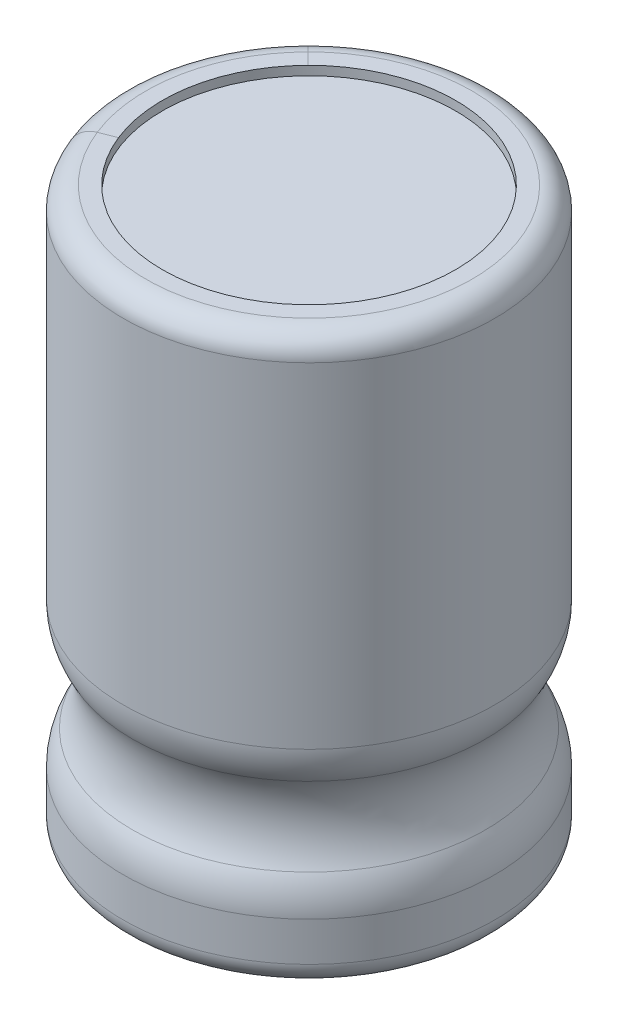
ISO-10303-21;
HEADER;
FILE_DESCRIPTION(('STEP AP214'),'2;1');
FILE_NAME('part.step','',(''),(''),'','','');
FILE_SCHEMA(('AUTOMOTIVE_DESIGN { 1 0 10303 214 1 1 1 1 }'));
ENDSEC;
DATA;
#1=APPLICATION_CONTEXT('core data for automotive mechanical design processes');
#2=APPLICATION_PROTOCOL_DEFINITION('international standard','automotive_design',2000,#1);
#3=PRODUCT_CONTEXT('',#1,'mechanical');
#4=PRODUCT('Part','Part','',(#3));
#5=PRODUCT_RELATED_PRODUCT_CATEGORY('part','',(#4));
#6=PRODUCT_DEFINITION_FORMATION('','',#4);
#7=PRODUCT_DEFINITION_CONTEXT('part definition',#1,'design');
#8=PRODUCT_DEFINITION('design','',#6,#7);
#9=PRODUCT_DEFINITION_SHAPE('','',#8);
#10=(LENGTH_UNIT() NAMED_UNIT(*) SI_UNIT(.MILLI.,.METRE.));
#11=(NAMED_UNIT(*) PLANE_ANGLE_UNIT() SI_UNIT($,.RADIAN.));
#12=(NAMED_UNIT(*) SI_UNIT($,.STERADIAN.) SOLID_ANGLE_UNIT());
#13=UNCERTAINTY_MEASURE_WITH_UNIT(LENGTH_MEASURE(1.E-05),#10,'distance_accuracy_value','');
#14=(GEOMETRIC_REPRESENTATION_CONTEXT(3) GLOBAL_UNCERTAINTY_ASSIGNED_CONTEXT((#13)) GLOBAL_UNIT_ASSIGNED_CONTEXT((#10,
#11,#12)) REPRESENTATION_CONTEXT('',''));
#15=CARTESIAN_POINT('',(0.,0.,0.));
#16=DIRECTION('',(0.,0.,1.));
#17=DIRECTION('',(1.,0.,0.));
#18=AXIS2_PLACEMENT_3D('',#15,#16,#17);
#19=CARTESIAN_POINT('',(0.,0.5,0.));
#20=DIRECTION('',(0.,1.,0.));
#21=DIRECTION('',(0.,0.,1.));
#22=AXIS2_PLACEMENT_3D('',#19,#20,#21);
#23=TOROIDAL_SURFACE('',#22,3.6,0.5);
#24=CARTESIAN_POINT('',(0.,0.,0.));
#25=DIRECTION('',(0.,1.,0.));
#26=DIRECTION('',(0.,0.,1.));
#27=AXIS2_PLACEMENT_3D('',#24,#25,#26);
#28=CIRCLE('',#27,3.6);
#29=CARTESIAN_POINT('',(-2.55822457726929,0.,-2.53288116820654));
#30=VERTEX_POINT('',#29);
#31=CARTESIAN_POINT('',(-3.34559380354316,0.,1.32928631291142));
#32=VERTEX_POINT('',#31);
#33=EDGE_CURVE('E138',#30,#32,#28,.F.);
#34=ORIENTED_EDGE('',*,*,#33,.F.);
#35=CARTESIAN_POINT('',(-2.5582245772693,0.5,-2.53288116820654));
#36=DIRECTION('',(-0.703578102279595,0.,0.71061793813036));
#37=DIRECTION('',(0.71061793813036,0.,0.703578102279595));
#38=AXIS2_PLACEMENT_3D('',#35,#36,#37);
#39=CIRCLE('',#38,0.5);
#40=CARTESIAN_POINT('',(-2.91353354633447,0.5,-2.88467021934634));
#41=VERTEX_POINT('',#40);
#42=EDGE_CURVE('E11',#30,#41,#39,.F.);
#43=ORIENTED_EDGE('',*,*,#42,.T.);
#44=CARTESIAN_POINT('',(0.,0.5,0.));
#45=DIRECTION('',(0.,1.,0.));
#46=DIRECTION('',(0.,0.,1.));
#47=AXIS2_PLACEMENT_3D('',#44,#45,#46);
#48=CIRCLE('',#47,4.1);
#49=CARTESIAN_POINT('',(-3.81025960959082,0.5,1.5139094119269));
#50=VERTEX_POINT('',#49);
#51=EDGE_CURVE('E132',#50,#41,#48,.T.);
#52=ORIENTED_EDGE('',*,*,#51,.F.);
#53=CARTESIAN_POINT('',(-3.34559380354316,0.5,1.32928631291142));
#54=DIRECTION('',(-0.36924619803095,0.,-0.929331612095321));
#55=DIRECTION('',(-0.929331612095321,0.,0.36924619803095));
#56=AXIS2_PLACEMENT_3D('',#53,#54,#55);
#57=CIRCLE('',#56,0.5);
#58=EDGE_CURVE('E47',#50,#32,#57,.F.);
#59=ORIENTED_EDGE('',*,*,#58,.T.);
#60=EDGE_LOOP('',(#34,#43,#52,#59));
#61=FACE_BOUND('',#60,.T.);
#62=ADVANCED_FACE('F37',(#61),#23,.T.);
#63=CARTESIAN_POINT('',(0.,12.5,0.));
#64=DIRECTION('',(0.,-1.,0.));
#65=DIRECTION('',(0.,0.,-1.));
#66=AXIS2_PLACEMENT_3D('',#63,#64,#65);
#67=CYLINDRICAL_SURFACE('',#66,4.1);
#68=DIRECTION('',(0.,-1.,0.));
#69=VECTOR('',#68,1.);
#70=CARTESIAN_POINT('',(-2.91353354633447,12.5,-2.88467021934634));
#71=LINE('',#70,#69);
#72=CARTESIAN_POINT('',(-2.91353354633447,1.3642201591767,-2.88467021934634));
#73=VERTEX_POINT('',#72);
#74=EDGE_CURVE('E164',#73,#41,#71,.T.);
#75=ORIENTED_EDGE('',*,*,#74,.F.);
#76=CARTESIAN_POINT('',(0.,1.3642201591767,0.));
#77=DIRECTION('',(0.,1.,0.));
#78=DIRECTION('',(0.,0.,1.));
#79=AXIS2_PLACEMENT_3D('',#76,#77,#78);
#80=CIRCLE('',#79,4.1);
#81=CARTESIAN_POINT('',(-3.81025960959082,1.3642201591767,1.5139094119269));
#82=VERTEX_POINT('',#81);
#83=EDGE_CURVE('E160',#73,#82,#80,.F.);
#84=ORIENTED_EDGE('',*,*,#83,.T.);
#85=DIRECTION('',(0.,-1.,0.));
#86=VECTOR('',#85,1.);
#87=CARTESIAN_POINT('',(-3.81025960959082,12.5,1.5139094119269));
#88=LINE('',#87,#86);
#89=EDGE_CURVE('E168',#50,#82,#88,.F.);
#90=ORIENTED_EDGE('',*,*,#89,.F.);
#91=ORIENTED_EDGE('',*,*,#51,.T.);
#92=EDGE_LOOP('',(#75,#84,#90,#91));
#93=FACE_BOUND('',#92,.T.);
#94=ADVANCED_FACE('F248',(#93),#67,.T.);
#95=CARTESIAN_POINT('',(0.,1.3642201591767,0.));
#96=DIRECTION('',(0.,1.,0.));
#97=DIRECTION('',(0.,0.,1.));
#98=AXIS2_PLACEMENT_3D('',#95,#96,#97);
#99=TOROIDAL_SURFACE('',#98,2.6,1.5);
#100=ORIENTED_EDGE('',*,*,#83,.F.);
#101=CARTESIAN_POINT('',(-1.84760663913893,1.3642201591767,-1.82930306592695));
#102=DIRECTION('',(-0.703578102279595,0.,0.71061793813036));
#103=DIRECTION('',(0.71061793813036,0.,0.703578102279595));
#104=AXIS2_PLACEMENT_3D('',#101,#102,#103);
#105=CIRCLE('',#104,1.5);
#106=CARTESIAN_POINT('',(-2.76822505052599,2.12028418742968,-2.74080124244572));
#107=VERTEX_POINT('',#106);
#108=EDGE_CURVE('E169',#73,#107,#105,.F.);
#109=ORIENTED_EDGE('',*,*,#108,.T.);
#110=CARTESIAN_POINT('',(0.,2.12028418742968,0.));
#111=DIRECTION('',(0.,1.,0.));
#112=DIRECTION('',(0.,0.,1.));
#113=AXIS2_PLACEMENT_3D('',#110,#111,#112);
#114=CIRCLE('',#113,3.89551811457111);
#115=CARTESIAN_POINT('',(-3.62022812936089,2.12028418742968,1.43840525316608));
#116=VERTEX_POINT('',#115);
#117=EDGE_CURVE('E152',#116,#107,#114,.T.);
#118=ORIENTED_EDGE('',*,*,#117,.F.);
#119=CARTESIAN_POINT('',(-2.41626219144783,1.3642201591767,0.96004011488047));
#120=DIRECTION('',(-0.36924619803095,0.,-0.929331612095321));
#121=DIRECTION('',(-0.929331612095321,0.,0.36924619803095));
#122=AXIS2_PLACEMENT_3D('',#119,#120,#121);
#123=CIRCLE('',#122,1.5);
#124=EDGE_CURVE('E172',#116,#82,#123,.F.);
#125=ORIENTED_EDGE('',*,*,#124,.T.);
#126=EDGE_LOOP('',(#100,#109,#118,#125));
#127=FACE_BOUND('',#126,.T.);
#128=ADVANCED_FACE('F245',(#127),#99,.T.);
#129=CARTESIAN_POINT('',(0.,2.98779587164433,0.));
#130=DIRECTION('',(0.,-1.,0.));
#131=DIRECTION('',(0.,0.,-1.));
#132=AXIS2_PLACEMENT_3D('',#129,#130,#131);
#133=TOROIDAL_SURFACE('',#132,5.38200214172298,1.72110757514648);
#134=CARTESIAN_POINT('',(-3.82454726496436,2.98779587164433,-3.78665885333817));
#135=DIRECTION('',(-0.703578102279595,0.,0.71061793813036));
#136=DIRECTION('',(0.71061793813036,0.,0.703578102279595));
#137=AXIS2_PLACEMENT_3D('',#134,#135,#136);
#138=CIRCLE('',#137,1.72110757514648);
#139=CARTESIAN_POINT('',(-2.76822505052599,3.85530755585897,-2.74080124244572));
#140=VERTEX_POINT('',#139);
#141=EDGE_CURVE('E173',#140,#107,#138,.F.);
#142=ORIENTED_EDGE('',*,*,#141,.F.);
#143=CARTESIAN_POINT('',(0.,3.85530755585897,0.));
#144=DIRECTION('',(0.,-1.,0.));
#145=DIRECTION('',(0.,0.,-1.));
#146=AXIS2_PLACEMENT_3D('',#143,#144,#145);
#147=CIRCLE('',#146,3.89551811457111);
#148=CARTESIAN_POINT('',(-3.62022812936089,3.85530755585897,1.43840525316608));
#149=VERTEX_POINT('',#148);
#150=EDGE_CURVE('E156',#140,#149,#147,.T.);
#151=ORIENTED_EDGE('',*,*,#150,.T.);
#152=CARTESIAN_POINT('',(-5.00166472666789,2.98779587164433,1.98728382862564));
#153=DIRECTION('',(-0.36924619803095,0.,-0.929331612095321));
#154=DIRECTION('',(-0.929331612095321,0.,0.36924619803095));
#155=AXIS2_PLACEMENT_3D('',#152,#153,#154);
#156=CIRCLE('',#155,1.72110757514648);
#157=EDGE_CURVE('E177',#116,#149,#156,.F.);
#158=ORIENTED_EDGE('',*,*,#157,.F.);
#159=ORIENTED_EDGE('',*,*,#117,.T.);
#160=EDGE_LOOP('',(#142,#151,#158,#159));
#161=FACE_BOUND('',#160,.T.);
#162=ADVANCED_FACE('F233',(#161),#133,.F.);
#163=CARTESIAN_POINT('',(0.,4.61137158411196,0.));
#164=DIRECTION('',(0.,-1.,0.));
#165=DIRECTION('',(0.,0.,-1.));
#166=AXIS2_PLACEMENT_3D('',#163,#164,#165);
#167=TOROIDAL_SURFACE('',#166,2.6,1.5);
#168=ORIENTED_EDGE('',*,*,#150,.F.);
#169=CARTESIAN_POINT('',(-1.84760663913893,4.61137158411196,-1.82930306592695));
#170=DIRECTION('',(-0.703578102279595,0.,0.71061793813036));
#171=DIRECTION('',(0.71061793813036,0.,0.703578102279595));
#172=AXIS2_PLACEMENT_3D('',#169,#170,#171);
#173=CIRCLE('',#172,1.5);
#174=CARTESIAN_POINT('',(-2.91353354633447,4.61137158411196,-2.88467021934634));
#175=VERTEX_POINT('',#174);
#176=EDGE_CURVE('E178',#140,#175,#173,.F.);
#177=ORIENTED_EDGE('',*,*,#176,.T.);
#178=CARTESIAN_POINT('',(0.,4.61137158411196,0.));
#179=DIRECTION('',(0.,-1.,0.));
#180=DIRECTION('',(0.,0.,-1.));
#181=AXIS2_PLACEMENT_3D('',#178,#179,#180);
#182=CIRCLE('',#181,4.1);
#183=CARTESIAN_POINT('',(-3.81025960959082,4.61137158411196,1.5139094119269));
#184=VERTEX_POINT('',#183);
#185=EDGE_CURVE('E148',#184,#175,#182,.F.);
#186=ORIENTED_EDGE('',*,*,#185,.F.);
#187=CARTESIAN_POINT('',(-2.41626219144783,4.61137158411196,0.96004011488047));
#188=DIRECTION('',(-0.36924619803095,0.,-0.929331612095321));
#189=DIRECTION('',(-0.929331612095321,0.,0.36924619803095));
#190=AXIS2_PLACEMENT_3D('',#187,#188,#189);
#191=CIRCLE('',#190,1.5);
#192=EDGE_CURVE('E181',#184,#149,#191,.F.);
#193=ORIENTED_EDGE('',*,*,#192,.T.);
#194=EDGE_LOOP('',(#168,#177,#186,#193));
#195=FACE_BOUND('',#194,.T.);
#196=ADVANCED_FACE('F230',(#195),#167,.T.);
#197=DIRECTION('',(0.,-1.,0.));
#198=VECTOR('',#197,1.);
#199=CARTESIAN_POINT('',(-2.91353354633447,12.5,-2.88467021934634));
#200=LINE('',#199,#198);
#201=CARTESIAN_POINT('',(-2.91353354633447,12.,-2.88467021934634));
#202=VERTEX_POINT('',#201);
#203=EDGE_CURVE('E182',#202,#175,#200,.T.);
#204=ORIENTED_EDGE('',*,*,#203,.F.);
#205=CARTESIAN_POINT('',(0.,12.,0.));
#206=DIRECTION('',(0.,1.,0.));
#207=DIRECTION('',(0.,0.,1.));
#208=AXIS2_PLACEMENT_3D('',#205,#206,#207);
#209=CIRCLE('',#208,4.1);
#210=CARTESIAN_POINT('',(-3.81025960959082,12.,1.5139094119269));
#211=VERTEX_POINT('',#210);
#212=EDGE_CURVE('E144',#202,#211,#209,.F.);
#213=ORIENTED_EDGE('',*,*,#212,.T.);
#214=DIRECTION('',(0.,-1.,0.));
#215=VECTOR('',#214,1.);
#216=CARTESIAN_POINT('',(-3.81025960959082,12.5,1.5139094119269));
#217=LINE('',#216,#215);
#218=EDGE_CURVE('E186',#184,#211,#217,.F.);
#219=ORIENTED_EDGE('',*,*,#218,.F.);
#220=ORIENTED_EDGE('',*,*,#185,.T.);
#221=EDGE_LOOP('',(#204,#213,#219,#220));
#222=FACE_BOUND('',#221,.T.);
#223=ADVANCED_FACE('F215',(#222),#67,.T.);
#224=CARTESIAN_POINT('',(0.,12.,0.));
#225=DIRECTION('',(0.,1.,0.));
#226=DIRECTION('',(0.,0.,1.));
#227=AXIS2_PLACEMENT_3D('',#224,#225,#226);
#228=TOROIDAL_SURFACE('',#227,3.6,0.5);
#229=ORIENTED_EDGE('',*,*,#212,.F.);
#230=CARTESIAN_POINT('',(-2.5582245772693,12.,-2.53288116820654));
#231=DIRECTION('',(-0.703578102279595,0.,0.71061793813036));
#232=DIRECTION('',(0.71061793813036,0.,0.703578102279595));
#233=AXIS2_PLACEMENT_3D('',#230,#231,#232);
#234=CIRCLE('',#233,0.5);
#235=CARTESIAN_POINT('',(-2.5582245772693,12.5,-2.53288116820654));
#236=VERTEX_POINT('',#235);
#237=EDGE_CURVE('E187',#202,#236,#234,.F.);
#238=ORIENTED_EDGE('',*,*,#237,.T.);
#239=CARTESIAN_POINT('',(0.,12.5,0.));
#240=DIRECTION('',(0.,1.,0.));
#241=DIRECTION('',(0.,0.,1.));
#242=AXIS2_PLACEMENT_3D('',#239,#240,#241);
#243=CIRCLE('',#242,3.6);
#244=CARTESIAN_POINT('',(-3.34559380354316,12.5,1.32928631291142));
#245=VERTEX_POINT('',#244);
#246=EDGE_CURVE('E117',#245,#236,#243,.T.);
#247=ORIENTED_EDGE('',*,*,#246,.F.);
#248=CARTESIAN_POINT('',(-3.34559380354316,12.,1.32928631291142));
#249=DIRECTION('',(-0.36924619803095,0.,-0.929331612095321));
#250=DIRECTION('',(-0.929331612095321,0.,0.36924619803095));
#251=AXIS2_PLACEMENT_3D('',#248,#249,#250);
#252=CIRCLE('',#251,0.5);
#253=EDGE_CURVE('E123',#245,#211,#252,.F.);
#254=ORIENTED_EDGE('',*,*,#253,.T.);
#255=EDGE_LOOP('',(#229,#238,#247,#254));
#256=FACE_BOUND('',#255,.T.);
#257=ADVANCED_FACE('F210',(#256),#228,.T.);
#258=CARTESIAN_POINT('',(0.,12.5,0.));
#259=DIRECTION('',(0.,1.,0.));
#260=DIRECTION('',(0.,0.,1.));
#261=AXIS2_PLACEMENT_3D('',#258,#259,#260);
#262=PLANE('',#261);
#263=ORIENTED_EDGE('',*,*,#246,.T.);
#264=DIRECTION('',(0.71061793813036,0.,0.703578102279595));
#265=VECTOR('',#264,1.);
#266=CARTESIAN_POINT('',(0.,12.5,0.));
#267=LINE('',#266,#265);
#268=CARTESIAN_POINT('',(-2.3002480800384,12.5,-2.2774603511751));
#269=VERTEX_POINT('',#268);
#270=EDGE_CURVE('E110',#236,#269,#267,.T.);
#271=ORIENTED_EDGE('',*,*,#270,.T.);
#272=CARTESIAN_POINT('',(0.,12.5,0.));
#273=DIRECTION('',(0.,1.,0.));
#274=DIRECTION('',(0.,0.,1.));
#275=AXIS2_PLACEMENT_3D('',#272,#273,#274);
#276=CIRCLE('',#275,3.236968779722);
#277=CARTESIAN_POINT('',(-3.00821741436127,12.5,1.19523841505723));
#278=VERTEX_POINT('',#277);
#279=EDGE_CURVE('E114',#278,#269,#276,.T.);
#280=ORIENTED_EDGE('',*,*,#279,.F.);
#281=DIRECTION('',(-0.929331612095321,0.,0.36924619803095));
#282=VECTOR('',#281,1.);
#283=CARTESIAN_POINT('',(0.,12.5,0.));
#284=LINE('',#283,#282);
#285=EDGE_CURVE('E41',#278,#245,#284,.T.);
#286=ORIENTED_EDGE('',*,*,#285,.T.);
#287=EDGE_LOOP('',(#263,#271,#280,#286));
#288=FACE_BOUND('',#287,.T.);
#289=ADVANCED_FACE('F112',(#288),#262,.T.);
#290=EDGE_CURVE('E161',#82,#73,#80,.F.);
#291=ORIENTED_EDGE('',*,*,#290,.T.);
#292=ORIENTED_EDGE('',*,*,#74,.T.);
#293=EDGE_CURVE('E135',#41,#50,#48,.T.);
#294=ORIENTED_EDGE('',*,*,#293,.T.);
#295=ORIENTED_EDGE('',*,*,#89,.T.);
#296=EDGE_LOOP('',(#291,#292,#294,#295));
#297=FACE_BOUND('',#296,.T.);
#298=ADVANCED_FACE('F251',(#297),#67,.T.);
#299=CARTESIAN_POINT('',(0.,0.,0.));
#300=DIRECTION('',(0.,1.,0.));
#301=DIRECTION('',(0.,0.,1.));
#302=AXIS2_PLACEMENT_3D('',#299,#300,#301);
#303=PLANE('',#302);
#304=EDGE_CURVE('E139',#32,#30,#28,.F.);
#305=ORIENTED_EDGE('',*,*,#304,.T.);
#306=ORIENTED_EDGE('',*,*,#33,.T.);
#307=EDGE_LOOP('',(#305,#306));
#308=FACE_BOUND('',#307,.T.);
#309=ADVANCED_FACE('F254',(#308),#303,.F.);
#310=EDGE_CURVE('E157',#149,#140,#147,.T.);
#311=ORIENTED_EDGE('',*,*,#310,.T.);
#312=ORIENTED_EDGE('',*,*,#141,.T.);
#313=EDGE_CURVE('E153',#107,#116,#114,.T.);
#314=ORIENTED_EDGE('',*,*,#313,.T.);
#315=ORIENTED_EDGE('',*,*,#157,.T.);
#316=EDGE_LOOP('',(#311,#312,#314,#315));
#317=FACE_BOUND('',#316,.T.);
#318=ADVANCED_FACE('F238',(#317),#133,.F.);
#319=ORIENTED_EDGE('',*,*,#270,.F.);
#320=EDGE_CURVE('E142',#236,#245,#243,.T.);
#321=ORIENTED_EDGE('',*,*,#320,.T.);
#322=ORIENTED_EDGE('',*,*,#285,.F.);
#323=EDGE_CURVE('E127',#269,#278,#276,.T.);
#324=ORIENTED_EDGE('',*,*,#323,.F.);
#325=EDGE_LOOP('',(#319,#321,#322,#324));
#326=FACE_BOUND('',#325,.T.);
#327=ADVANCED_FACE('F129',(#326),#262,.T.);
#328=EDGE_CURVE('E145',#211,#202,#209,.F.);
#329=ORIENTED_EDGE('',*,*,#328,.T.);
#330=ORIENTED_EDGE('',*,*,#203,.T.);
#331=EDGE_CURVE('E149',#175,#184,#182,.F.);
#332=ORIENTED_EDGE('',*,*,#331,.T.);
#333=ORIENTED_EDGE('',*,*,#218,.T.);
#334=EDGE_LOOP('',(#329,#330,#332,#333));
#335=FACE_BOUND('',#334,.T.);
#336=ADVANCED_FACE('F221',(#335),#67,.T.);
#337=ORIENTED_EDGE('',*,*,#42,.F.);
#338=ORIENTED_EDGE('',*,*,#304,.F.);
#339=ORIENTED_EDGE('',*,*,#58,.F.);
#340=ORIENTED_EDGE('',*,*,#293,.F.);
#341=EDGE_LOOP('',(#337,#338,#339,#340));
#342=FACE_BOUND('',#341,.T.);
#343=ADVANCED_FACE('F252',(#342),#23,.T.);
#344=ORIENTED_EDGE('',*,*,#237,.F.);
#345=ORIENTED_EDGE('',*,*,#328,.F.);
#346=ORIENTED_EDGE('',*,*,#253,.F.);
#347=ORIENTED_EDGE('',*,*,#320,.F.);
#348=EDGE_LOOP('',(#344,#345,#346,#347));
#349=FACE_BOUND('',#348,.T.);
#350=ADVANCED_FACE('F219',(#349),#228,.T.);
#351=ORIENTED_EDGE('',*,*,#176,.F.);
#352=ORIENTED_EDGE('',*,*,#310,.F.);
#353=ORIENTED_EDGE('',*,*,#192,.F.);
#354=ORIENTED_EDGE('',*,*,#331,.F.);
#355=EDGE_LOOP('',(#351,#352,#353,#354));
#356=FACE_BOUND('',#355,.T.);
#357=ADVANCED_FACE('F225',(#356),#167,.T.);
#358=ORIENTED_EDGE('',*,*,#108,.F.);
#359=ORIENTED_EDGE('',*,*,#290,.F.);
#360=ORIENTED_EDGE('',*,*,#124,.F.);
#361=ORIENTED_EDGE('',*,*,#313,.F.);
#362=EDGE_LOOP('',(#358,#359,#360,#361));
#363=FACE_BOUND('',#362,.T.);
#364=ADVANCED_FACE('F39',(#363),#99,.T.);
#365=CARTESIAN_POINT('',(0.,12.3,0.));
#366=DIRECTION('',(0.,1.,0.));
#367=DIRECTION('',(0.,0.,1.));
#368=AXIS2_PLACEMENT_3D('',#365,#366,#367);
#369=CYLINDRICAL_SURFACE('',#368,3.236968779722);
#370=CARTESIAN_POINT('',(0.,12.3,0.));
#371=DIRECTION('',(0.,1.,0.));
#372=DIRECTION('',(0.,0.,1.));
#373=AXIS2_PLACEMENT_3D('',#370,#371,#372);
#374=CIRCLE('',#373,3.236968779722);
#375=CARTESIAN_POINT('',(0.,12.3,3.236968779722));
#376=VERTEX_POINT('',#375);
#377=EDGE_CURVE('E130',#376,#376,#374,.T.);
#378=ORIENTED_EDGE('',*,*,#377,.F.);
#379=EDGE_LOOP('',(#378));
#380=FACE_BOUND('',#379,.T.);
#381=ORIENTED_EDGE('',*,*,#323,.T.);
#382=ORIENTED_EDGE('',*,*,#279,.T.);
#383=EDGE_LOOP('',(#381,#382));
#384=FACE_BOUND('',#383,.T.);
#385=ADVANCED_FACE('F126',(#380,#384),#369,.F.);
#386=CARTESIAN_POINT('',(0.,12.3,0.));
#387=DIRECTION('',(0.,1.,0.));
#388=DIRECTION('',(0.,0.,1.));
#389=AXIS2_PLACEMENT_3D('',#386,#387,#388);
#390=PLANE('',#389);
#391=ORIENTED_EDGE('',*,*,#377,.T.);
#392=EDGE_LOOP('',(#391));
#393=FACE_BOUND('',#392,.T.);
#394=ADVANCED_FACE('F293',(#393),#390,.T.);
#395=CLOSED_SHELL('',(#62,#94,#128,#162,#196,#223,#257,#289,#298,#309,#318,#327,#336,#343,#350,
#357,#364,#385,#394));
#396=MANIFOLD_SOLID_BREP('B2',#395);
#397=ADVANCED_BREP_SHAPE_REPRESENTATION('',(#18,#396),#14);
#398=SHAPE_DEFINITION_REPRESENTATION(#9,#397);
ENDSEC;
END-ISO-10303-21;
